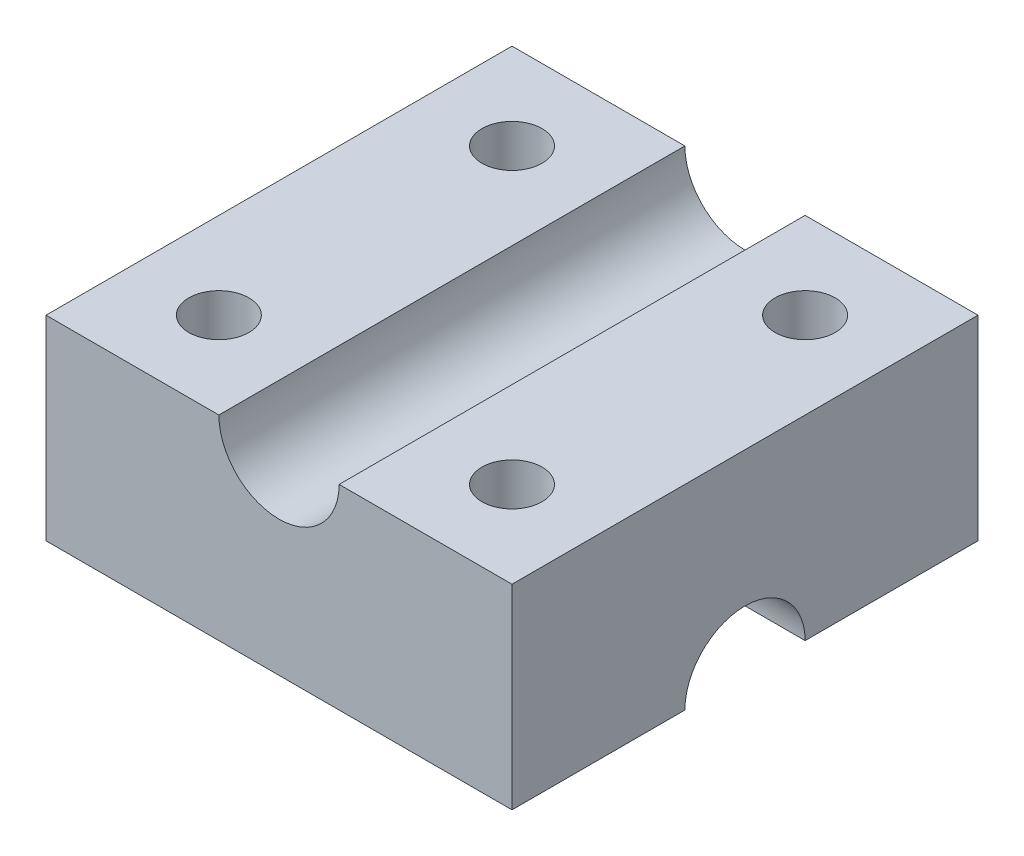
ISO-10303-21;
HEADER;
FILE_DESCRIPTION(('STEP AP214'),'2;1');
FILE_NAME('part.step','',(''),(''),'','','');
FILE_SCHEMA(('AUTOMOTIVE_DESIGN { 1 0 10303 214 1 1 1 1 }'));
ENDSEC;
DATA;
#1=APPLICATION_CONTEXT('core data for automotive mechanical design processes');
#2=APPLICATION_PROTOCOL_DEFINITION('international standard','automotive_design',2000,#1);
#3=PRODUCT_CONTEXT('',#1,'mechanical');
#4=PRODUCT('Part','Part','',(#3));
#5=PRODUCT_RELATED_PRODUCT_CATEGORY('part','',(#4));
#6=PRODUCT_DEFINITION_FORMATION('','',#4);
#7=PRODUCT_DEFINITION_CONTEXT('part definition',#1,'design');
#8=PRODUCT_DEFINITION('design','',#6,#7);
#9=PRODUCT_DEFINITION_SHAPE('','',#8);
#10=(LENGTH_UNIT() NAMED_UNIT(*) SI_UNIT(.MILLI.,.METRE.));
#11=(NAMED_UNIT(*) PLANE_ANGLE_UNIT() SI_UNIT($,.RADIAN.));
#12=(NAMED_UNIT(*) SI_UNIT($,.STERADIAN.) SOLID_ANGLE_UNIT());
#13=UNCERTAINTY_MEASURE_WITH_UNIT(LENGTH_MEASURE(1.E-05),#10,'distance_accuracy_value','');
#14=(GEOMETRIC_REPRESENTATION_CONTEXT(3) GLOBAL_UNCERTAINTY_ASSIGNED_CONTEXT((#13)) GLOBAL_UNIT_ASSIGNED_CONTEXT((#10,
#11,#12)) REPRESENTATION_CONTEXT('',''));
#15=CARTESIAN_POINT('',(0.,0.,0.));
#16=DIRECTION('',(0.,0.,1.));
#17=DIRECTION('',(1.,0.,0.));
#18=AXIS2_PLACEMENT_3D('',#15,#16,#17);
#19=CARTESIAN_POINT('',(-15.5,-6.5,31.));
#20=DIRECTION('',(0.,1.,0.));
#21=DIRECTION('',(0.,0.,1.));
#22=AXIS2_PLACEMENT_3D('',#19,#20,#21);
#23=PLANE('',#22);
#24=CARTESIAN_POINT('',(-9.75,-6.5,5.75));
#25=DIRECTION('',(0.,1.,0.));
#26=DIRECTION('',(0.,0.,-1.));
#27=AXIS2_PLACEMENT_3D('',#24,#25,#26);
#28=CIRCLE('',#27,2.);
#29=CARTESIAN_POINT('',(-9.75,-6.5,3.75));
#30=VERTEX_POINT('',#29);
#31=EDGE_CURVE('E232',#30,#30,#28,.T.);
#32=ORIENTED_EDGE('',*,*,#31,.T.);
#33=EDGE_LOOP('',(#32));
#34=FACE_BOUND('',#33,.T.);
#35=CARTESIAN_POINT('',(9.75,-6.5,5.75));
#36=DIRECTION('',(0.,1.,0.));
#37=DIRECTION('',(0.,0.,1.));
#38=AXIS2_PLACEMENT_3D('',#35,#36,#37);
#39=CIRCLE('',#38,2.);
#40=CARTESIAN_POINT('',(9.75,-6.5,7.75));
#41=VERTEX_POINT('',#40);
#42=EDGE_CURVE('E235',#41,#41,#39,.T.);
#43=ORIENTED_EDGE('',*,*,#42,.T.);
#44=EDGE_LOOP('',(#43));
#45=FACE_BOUND('',#44,.T.);
#46=DIRECTION('',(0.,0.,-1.));
#47=VECTOR('',#46,1.);
#48=CARTESIAN_POINT('',(15.5,-6.5,31.));
#49=LINE('',#48,#47);
#50=CARTESIAN_POINT('',(15.5,-6.5,11.5));
#51=VERTEX_POINT('',#50);
#52=CARTESIAN_POINT('',(15.5,-6.5,0.));
#53=VERTEX_POINT('',#52);
#54=EDGE_CURVE('E158',#51,#53,#49,.T.);
#55=ORIENTED_EDGE('',*,*,#54,.F.);
#56=DIRECTION('',(-1.,0.,0.));
#57=VECTOR('',#56,1.);
#58=CARTESIAN_POINT('',(15.5,-6.5,11.5));
#59=LINE('',#58,#57);
#60=CARTESIAN_POINT('',(-15.5,-6.5,11.5));
#61=VERTEX_POINT('',#60);
#62=EDGE_CURVE('E58',#51,#61,#59,.T.);
#63=ORIENTED_EDGE('',*,*,#62,.T.);
#64=DIRECTION('',(0.,0.,-1.));
#65=VECTOR('',#64,1.);
#66=CARTESIAN_POINT('',(-15.5,-6.5,31.));
#67=LINE('',#66,#65);
#68=CARTESIAN_POINT('',(-15.5,-6.5,0.));
#69=VERTEX_POINT('',#68);
#70=EDGE_CURVE('E132',#61,#69,#67,.T.);
#71=ORIENTED_EDGE('',*,*,#70,.T.);
#72=DIRECTION('',(1.,0.,0.));
#73=VECTOR('',#72,1.);
#74=CARTESIAN_POINT('',(-15.5,-6.5,0.));
#75=LINE('',#74,#73);
#76=EDGE_CURVE('E152',#69,#53,#75,.T.);
#77=ORIENTED_EDGE('',*,*,#76,.T.);
#78=EDGE_LOOP('',(#55,#63,#71,#77));
#79=FACE_BOUND('',#78,.T.);
#80=ADVANCED_FACE('F43',(#34,#45,#79),#23,.F.);
#81=CARTESIAN_POINT('',(4.,6.5,31.));
#82=DIRECTION('',(0.,-1.,0.));
#83=DIRECTION('',(0.,0.,-1.));
#84=AXIS2_PLACEMENT_3D('',#81,#82,#83);
#85=PLANE('',#84);
#86=CARTESIAN_POINT('',(9.75,6.5,25.25));
#87=DIRECTION('',(0.,1.,0.));
#88=DIRECTION('',(0.,0.,-1.));
#89=AXIS2_PLACEMENT_3D('',#86,#87,#88);
#90=CIRCLE('',#89,2.);
#91=CARTESIAN_POINT('',(9.75,6.5,23.25));
#92=VERTEX_POINT('',#91);
#93=EDGE_CURVE('E218',#92,#92,#90,.T.);
#94=ORIENTED_EDGE('',*,*,#93,.F.);
#95=EDGE_LOOP('',(#94));
#96=FACE_BOUND('',#95,.T.);
#97=CARTESIAN_POINT('',(9.75,6.5,5.75));
#98=DIRECTION('',(0.,1.,0.));
#99=DIRECTION('',(0.,0.,1.));
#100=AXIS2_PLACEMENT_3D('',#97,#98,#99);
#101=CIRCLE('',#100,2.);
#102=CARTESIAN_POINT('',(9.75,6.5,7.75));
#103=VERTEX_POINT('',#102);
#104=EDGE_CURVE('E222',#103,#103,#101,.T.);
#105=ORIENTED_EDGE('',*,*,#104,.F.);
#106=EDGE_LOOP('',(#105));
#107=FACE_BOUND('',#106,.T.);
#108=DIRECTION('',(-1.,0.,0.));
#109=VECTOR('',#108,1.);
#110=CARTESIAN_POINT('',(4.,6.5,0.));
#111=LINE('',#110,#109);
#112=CARTESIAN_POINT('',(15.5,6.5,0.));
#113=VERTEX_POINT('',#112);
#114=CARTESIAN_POINT('',(4.,6.5,0.));
#115=VERTEX_POINT('',#114);
#116=EDGE_CURVE('E142',#113,#115,#111,.T.);
#117=ORIENTED_EDGE('',*,*,#116,.T.);
#118=DIRECTION('',(0.,0.,-1.));
#119=VECTOR('',#118,1.);
#120=CARTESIAN_POINT('',(4.,6.5,31.));
#121=LINE('',#120,#119);
#122=CARTESIAN_POINT('',(4.,6.5,31.));
#123=VERTEX_POINT('',#122);
#124=EDGE_CURVE('E11',#123,#115,#121,.T.);
#125=ORIENTED_EDGE('',*,*,#124,.F.);
#126=DIRECTION('',(-1.,0.,0.));
#127=VECTOR('',#126,1.);
#128=CARTESIAN_POINT('',(4.,6.5,31.));
#129=LINE('',#128,#127);
#130=CARTESIAN_POINT('',(15.5,6.5,31.));
#131=VERTEX_POINT('',#130);
#132=EDGE_CURVE('E156',#131,#123,#129,.T.);
#133=ORIENTED_EDGE('',*,*,#132,.F.);
#134=DIRECTION('',(0.,0.,-1.));
#135=VECTOR('',#134,1.);
#136=CARTESIAN_POINT('',(15.5,6.5,31.));
#137=LINE('',#136,#135);
#138=EDGE_CURVE('E138',#131,#113,#137,.T.);
#139=ORIENTED_EDGE('',*,*,#138,.T.);
#140=EDGE_LOOP('',(#117,#125,#133,#139));
#141=FACE_BOUND('',#140,.T.);
#142=ADVANCED_FACE('F45',(#96,#107,#141),#85,.F.);
#143=CARTESIAN_POINT('',(0.,6.5,31.));
#144=DIRECTION('',(0.,0.,-1.));
#145=DIRECTION('',(-1.,0.,0.));
#146=AXIS2_PLACEMENT_3D('',#143,#144,#145);
#147=CYLINDRICAL_SURFACE('',#146,4.);
#148=CARTESIAN_POINT('',(0.,6.5,0.));
#149=DIRECTION('',(0.,0.,-1.));
#150=DIRECTION('',(1.,0.,0.));
#151=AXIS2_PLACEMENT_3D('',#148,#149,#150);
#152=CIRCLE('',#151,4.);
#153=CARTESIAN_POINT('',(-4.,6.5,0.));
#154=VERTEX_POINT('',#153);
#155=EDGE_CURVE('E145',#115,#154,#152,.T.);
#156=ORIENTED_EDGE('',*,*,#155,.T.);
#157=DIRECTION('',(0.,0.,-1.));
#158=VECTOR('',#157,1.);
#159=CARTESIAN_POINT('',(-4.,6.5,31.));
#160=LINE('',#159,#158);
#161=CARTESIAN_POINT('',(-4.,6.5,31.));
#162=VERTEX_POINT('',#161);
#163=EDGE_CURVE('E51',#162,#154,#160,.T.);
#164=ORIENTED_EDGE('',*,*,#163,.F.);
#165=CARTESIAN_POINT('',(0.,6.5,31.));
#166=DIRECTION('',(0.,0.,-1.));
#167=DIRECTION('',(1.,0.,0.));
#168=AXIS2_PLACEMENT_3D('',#165,#166,#167);
#169=CIRCLE('',#168,4.);
#170=EDGE_CURVE('E101',#123,#162,#169,.T.);
#171=ORIENTED_EDGE('',*,*,#170,.F.);
#172=ORIENTED_EDGE('',*,*,#124,.T.);
#173=EDGE_LOOP('',(#156,#164,#171,#172));
#174=FACE_BOUND('',#173,.T.);
#175=ADVANCED_FACE('F181',(#174),#147,.F.);
#176=CARTESIAN_POINT('',(-15.5,6.5,31.));
#177=DIRECTION('',(0.,-1.,0.));
#178=DIRECTION('',(0.,0.,-1.));
#179=AXIS2_PLACEMENT_3D('',#176,#177,#178);
#180=PLANE('',#179);
#181=CARTESIAN_POINT('',(-9.75,6.5,5.75));
#182=DIRECTION('',(0.,1.,0.));
#183=DIRECTION('',(0.,0.,-1.));
#184=AXIS2_PLACEMENT_3D('',#181,#182,#183);
#185=CIRCLE('',#184,2.);
#186=CARTESIAN_POINT('',(-9.75,6.5,3.75));
#187=VERTEX_POINT('',#186);
#188=EDGE_CURVE('E229',#187,#187,#185,.T.);
#189=ORIENTED_EDGE('',*,*,#188,.F.);
#190=EDGE_LOOP('',(#189));
#191=FACE_BOUND('',#190,.T.);
#192=CARTESIAN_POINT('',(-9.75,6.5,25.25));
#193=DIRECTION('',(0.,1.,0.));
#194=DIRECTION('',(0.,0.,1.));
#195=AXIS2_PLACEMENT_3D('',#192,#193,#194);
#196=CIRCLE('',#195,2.);
#197=CARTESIAN_POINT('',(-9.75,6.5,27.25));
#198=VERTEX_POINT('',#197);
#199=EDGE_CURVE('E219',#198,#198,#196,.T.);
#200=ORIENTED_EDGE('',*,*,#199,.F.);
#201=EDGE_LOOP('',(#200));
#202=FACE_BOUND('',#201,.T.);
#203=DIRECTION('',(-1.,0.,0.));
#204=VECTOR('',#203,1.);
#205=CARTESIAN_POINT('',(-15.5,6.5,0.));
#206=LINE('',#205,#204);
#207=CARTESIAN_POINT('',(-15.5,6.5,0.));
#208=VERTEX_POINT('',#207);
#209=EDGE_CURVE('E147',#154,#208,#206,.T.);
#210=ORIENTED_EDGE('',*,*,#209,.T.);
#211=DIRECTION('',(0.,0.,-1.));
#212=VECTOR('',#211,1.);
#213=CARTESIAN_POINT('',(-15.5,6.5,31.));
#214=LINE('',#213,#212);
#215=CARTESIAN_POINT('',(-15.5,6.5,31.));
#216=VERTEX_POINT('',#215);
#217=EDGE_CURVE('E131',#216,#208,#214,.T.);
#218=ORIENTED_EDGE('',*,*,#217,.F.);
#219=DIRECTION('',(-1.,0.,0.));
#220=VECTOR('',#219,1.);
#221=CARTESIAN_POINT('',(-15.5,6.5,31.));
#222=LINE('',#221,#220);
#223=EDGE_CURVE('E117',#162,#216,#222,.T.);
#224=ORIENTED_EDGE('',*,*,#223,.F.);
#225=ORIENTED_EDGE('',*,*,#163,.T.);
#226=EDGE_LOOP('',(#210,#218,#224,#225));
#227=FACE_BOUND('',#226,.T.);
#228=ADVANCED_FACE('F163',(#191,#202,#227),#180,.F.);
#229=CARTESIAN_POINT('',(-15.5,6.5,31.));
#230=DIRECTION('',(1.,0.,0.));
#231=DIRECTION('',(0.,0.,-1.));
#232=AXIS2_PLACEMENT_3D('',#229,#230,#231);
#233=PLANE('',#232);
#234=CARTESIAN_POINT('',(-15.5,1.5,15.5));
#235=DIRECTION('',(-1.,0.,0.));
#236=DIRECTION('',(0.,0.,1.));
#237=AXIS2_PLACEMENT_3D('',#234,#235,#236);
#238=CIRCLE('',#237,2.);
#239=CARTESIAN_POINT('',(-15.5,1.5,17.5));
#240=VERTEX_POINT('',#239);
#241=EDGE_CURVE('E372',#240,#240,#238,.T.);
#242=ORIENTED_EDGE('',*,*,#241,.F.);
#243=EDGE_LOOP('',(#242));
#244=FACE_BOUND('',#243,.T.);
#245=ORIENTED_EDGE('',*,*,#70,.F.);
#246=CARTESIAN_POINT('',(-15.5,-6.5,15.5));
#247=DIRECTION('',(-1.,0.,0.));
#248=DIRECTION('',(0.,0.,1.));
#249=AXIS2_PLACEMENT_3D('',#246,#247,#248);
#250=CIRCLE('',#249,4.);
#251=CARTESIAN_POINT('',(-15.5,-6.5,19.5));
#252=VERTEX_POINT('',#251);
#253=EDGE_CURVE('E128',#252,#61,#250,.T.);
#254=ORIENTED_EDGE('',*,*,#253,.F.);
#255=CARTESIAN_POINT('',(-15.5,-6.5,31.));
#256=VERTEX_POINT('',#255);
#257=EDGE_CURVE('E124',#256,#252,#67,.T.);
#258=ORIENTED_EDGE('',*,*,#257,.F.);
#259=DIRECTION('',(0.,-1.,0.));
#260=VECTOR('',#259,1.);
#261=CARTESIAN_POINT('',(-15.5,6.5,31.));
#262=LINE('',#261,#260);
#263=EDGE_CURVE('E110',#216,#256,#262,.T.);
#264=ORIENTED_EDGE('',*,*,#263,.F.);
#265=ORIENTED_EDGE('',*,*,#217,.T.);
#266=DIRECTION('',(0.,-1.,0.));
#267=VECTOR('',#266,1.);
#268=CARTESIAN_POINT('',(-15.5,6.5,0.));
#269=LINE('',#268,#267);
#270=EDGE_CURVE('E149',#208,#69,#269,.T.);
#271=ORIENTED_EDGE('',*,*,#270,.T.);
#272=EDGE_LOOP('',(#245,#254,#258,#264,#265,#271));
#273=FACE_BOUND('',#272,.T.);
#274=ADVANCED_FACE('F126',(#244,#273),#233,.F.);
#275=CARTESIAN_POINT('',(-9.75,-6.5,25.25));
#276=DIRECTION('',(0.,1.,0.));
#277=DIRECTION('',(0.,0.,1.));
#278=AXIS2_PLACEMENT_3D('',#275,#276,#277);
#279=CIRCLE('',#278,2.);
#280=CARTESIAN_POINT('',(-9.75,-6.5,27.25));
#281=VERTEX_POINT('',#280);
#282=EDGE_CURVE('E213',#281,#281,#279,.T.);
#283=ORIENTED_EDGE('',*,*,#282,.T.);
#284=EDGE_LOOP('',(#283));
#285=FACE_BOUND('',#284,.T.);
#286=CARTESIAN_POINT('',(9.75,-6.5,25.25));
#287=DIRECTION('',(0.,1.,0.));
#288=DIRECTION('',(0.,0.,-1.));
#289=AXIS2_PLACEMENT_3D('',#286,#287,#288);
#290=CIRCLE('',#289,2.);
#291=CARTESIAN_POINT('',(9.75,-6.5,23.25));
#292=VERTEX_POINT('',#291);
#293=EDGE_CURVE('E216',#292,#292,#290,.T.);
#294=ORIENTED_EDGE('',*,*,#293,.T.);
#295=EDGE_LOOP('',(#294));
#296=FACE_BOUND('',#295,.T.);
#297=ORIENTED_EDGE('',*,*,#257,.T.);
#298=DIRECTION('',(-1.,0.,0.));
#299=VECTOR('',#298,1.);
#300=CARTESIAN_POINT('',(15.5,-6.5,19.5));
#301=LINE('',#300,#299);
#302=CARTESIAN_POINT('',(15.5,-6.5,19.5));
#303=VERTEX_POINT('',#302);
#304=EDGE_CURVE('E171',#252,#303,#301,.F.);
#305=ORIENTED_EDGE('',*,*,#304,.T.);
#306=CARTESIAN_POINT('',(15.5,-6.5,31.));
#307=VERTEX_POINT('',#306);
#308=EDGE_CURVE('E136',#307,#303,#49,.T.);
#309=ORIENTED_EDGE('',*,*,#308,.F.);
#310=DIRECTION('',(1.,0.,0.));
#311=VECTOR('',#310,1.);
#312=CARTESIAN_POINT('',(-15.5,-6.5,31.));
#313=LINE('',#312,#311);
#314=EDGE_CURVE('E114',#256,#307,#313,.T.);
#315=ORIENTED_EDGE('',*,*,#314,.F.);
#316=EDGE_LOOP('',(#297,#305,#309,#315));
#317=FACE_BOUND('',#316,.T.);
#318=ADVANCED_FACE('F134',(#285,#296,#317),#23,.F.);
#319=CARTESIAN_POINT('',(15.5,6.5,31.));
#320=DIRECTION('',(-1.,0.,0.));
#321=DIRECTION('',(0.,0.,1.));
#322=AXIS2_PLACEMENT_3D('',#319,#320,#321);
#323=PLANE('',#322);
#324=ORIENTED_EDGE('',*,*,#308,.T.);
#325=CARTESIAN_POINT('',(15.5,-6.5,15.5));
#326=DIRECTION('',(-1.,0.,0.));
#327=DIRECTION('',(0.,0.,1.));
#328=AXIS2_PLACEMENT_3D('',#325,#326,#327);
#329=CIRCLE('',#328,4.);
#330=EDGE_CURVE('E173',#303,#51,#329,.T.);
#331=ORIENTED_EDGE('',*,*,#330,.T.);
#332=ORIENTED_EDGE('',*,*,#54,.T.);
#333=DIRECTION('',(0.,1.,0.));
#334=VECTOR('',#333,1.);
#335=CARTESIAN_POINT('',(15.5,6.5,0.));
#336=LINE('',#335,#334);
#337=EDGE_CURVE('E93',#53,#113,#336,.T.);
#338=ORIENTED_EDGE('',*,*,#337,.T.);
#339=ORIENTED_EDGE('',*,*,#138,.F.);
#340=DIRECTION('',(0.,1.,0.));
#341=VECTOR('',#340,1.);
#342=CARTESIAN_POINT('',(15.5,6.5,31.));
#343=LINE('',#342,#341);
#344=EDGE_CURVE('E67',#307,#131,#343,.T.);
#345=ORIENTED_EDGE('',*,*,#344,.F.);
#346=EDGE_LOOP('',(#324,#331,#332,#338,#339,#345));
#347=FACE_BOUND('',#346,.T.);
#348=ADVANCED_FACE('F202',(#347),#323,.F.);
#349=CARTESIAN_POINT('',(0.,6.5,31.));
#350=DIRECTION('',(0.,0.,1.));
#351=DIRECTION('',(1.,0.,0.));
#352=AXIS2_PLACEMENT_3D('',#349,#350,#351);
#353=PLANE('',#352);
#354=ORIENTED_EDGE('',*,*,#132,.T.);
#355=ORIENTED_EDGE('',*,*,#170,.T.);
#356=ORIENTED_EDGE('',*,*,#223,.T.);
#357=ORIENTED_EDGE('',*,*,#263,.T.);
#358=ORIENTED_EDGE('',*,*,#314,.T.);
#359=ORIENTED_EDGE('',*,*,#344,.T.);
#360=EDGE_LOOP('',(#354,#355,#356,#357,#358,#359));
#361=FACE_BOUND('',#360,.T.);
#362=ADVANCED_FACE('F112',(#361),#353,.T.);
#363=CARTESIAN_POINT('',(0.,6.5,0.));
#364=DIRECTION('',(0.,0.,1.));
#365=DIRECTION('',(1.,0.,0.));
#366=AXIS2_PLACEMENT_3D('',#363,#364,#365);
#367=PLANE('',#366);
#368=ORIENTED_EDGE('',*,*,#116,.F.);
#369=ORIENTED_EDGE('',*,*,#337,.F.);
#370=ORIENTED_EDGE('',*,*,#76,.F.);
#371=ORIENTED_EDGE('',*,*,#270,.F.);
#372=ORIENTED_EDGE('',*,*,#209,.F.);
#373=ORIENTED_EDGE('',*,*,#155,.F.);
#374=EDGE_LOOP('',(#368,#369,#370,#371,#372,#373));
#375=FACE_BOUND('',#374,.T.);
#376=ADVANCED_FACE('F167',(#375),#367,.F.);
#377=CARTESIAN_POINT('',(15.5,-6.5,15.5));
#378=DIRECTION('',(-1.,0.,0.));
#379=DIRECTION('',(0.,0.,1.));
#380=AXIS2_PLACEMENT_3D('',#377,#378,#379);
#381=CYLINDRICAL_SURFACE('',#380,4.);
#382=ORIENTED_EDGE('',*,*,#330,.F.);
#383=ORIENTED_EDGE('',*,*,#304,.F.);
#384=ORIENTED_EDGE('',*,*,#253,.T.);
#385=ORIENTED_EDGE('',*,*,#62,.F.);
#386=EDGE_LOOP('',(#382,#383,#384,#385));
#387=FACE_BOUND('',#386,.T.);
#388=ADVANCED_FACE('F241',(#387),#381,.F.);
#389=CARTESIAN_POINT('',(9.75,-6.5,25.25));
#390=DIRECTION('',(0.,1.,0.));
#391=DIRECTION('',(0.,0.,1.));
#392=AXIS2_PLACEMENT_3D('',#389,#390,#391);
#393=CYLINDRICAL_SURFACE('',#392,2.);
#394=ORIENTED_EDGE('',*,*,#293,.F.);
#395=EDGE_LOOP('',(#394));
#396=FACE_BOUND('',#395,.T.);
#397=ORIENTED_EDGE('',*,*,#93,.T.);
#398=EDGE_LOOP('',(#397));
#399=FACE_BOUND('',#398,.T.);
#400=ADVANCED_FACE('F244',(#396,#399),#393,.F.);
#401=CARTESIAN_POINT('',(-9.75,-6.5,25.25));
#402=DIRECTION('',(0.,1.,0.));
#403=DIRECTION('',(0.,0.,1.));
#404=AXIS2_PLACEMENT_3D('',#401,#402,#403);
#405=CYLINDRICAL_SURFACE('',#404,2.);
#406=ORIENTED_EDGE('',*,*,#282,.F.);
#407=EDGE_LOOP('',(#406));
#408=FACE_BOUND('',#407,.T.);
#409=ORIENTED_EDGE('',*,*,#199,.T.);
#410=EDGE_LOOP('',(#409));
#411=FACE_BOUND('',#410,.T.);
#412=ADVANCED_FACE('F248',(#408,#411),#405,.F.);
#413=CARTESIAN_POINT('',(-9.75,-6.5,5.75));
#414=DIRECTION('',(0.,1.,0.));
#415=DIRECTION('',(0.,0.,1.));
#416=AXIS2_PLACEMENT_3D('',#413,#414,#415);
#417=CYLINDRICAL_SURFACE('',#416,2.);
#418=ORIENTED_EDGE('',*,*,#31,.F.);
#419=EDGE_LOOP('',(#418));
#420=FACE_BOUND('',#419,.T.);
#421=ORIENTED_EDGE('',*,*,#188,.T.);
#422=EDGE_LOOP('',(#421));
#423=FACE_BOUND('',#422,.T.);
#424=ADVANCED_FACE('F326',(#420,#423),#417,.F.);
#425=CARTESIAN_POINT('',(9.75,-6.5,5.75));
#426=DIRECTION('',(0.,1.,0.));
#427=DIRECTION('',(0.,0.,1.));
#428=AXIS2_PLACEMENT_3D('',#425,#426,#427);
#429=CYLINDRICAL_SURFACE('',#428,2.);
#430=ORIENTED_EDGE('',*,*,#42,.F.);
#431=EDGE_LOOP('',(#430));
#432=FACE_BOUND('',#431,.T.);
#433=ORIENTED_EDGE('',*,*,#104,.T.);
#434=EDGE_LOOP('',(#433));
#435=FACE_BOUND('',#434,.T.);
#436=ADVANCED_FACE('F254',(#432,#435),#429,.F.);
#437=CARTESIAN_POINT('',(-5.5,1.5,15.5));
#438=DIRECTION('',(-1.,0.,0.));
#439=DIRECTION('',(0.,0.,1.));
#440=AXIS2_PLACEMENT_3D('',#437,#438,#439);
#441=CYLINDRICAL_SURFACE('',#440,2.);
#442=CARTESIAN_POINT('',(-5.5,1.5,15.5));
#443=DIRECTION('',(-1.,0.,0.));
#444=DIRECTION('',(0.,0.,1.));
#445=AXIS2_PLACEMENT_3D('',#442,#443,#444);
#446=CIRCLE('',#445,2.);
#447=CARTESIAN_POINT('',(-5.5,1.5,17.5));
#448=VERTEX_POINT('',#447);
#449=EDGE_CURVE('E234',#448,#448,#446,.T.);
#450=ORIENTED_EDGE('',*,*,#449,.F.);
#451=EDGE_LOOP('',(#450));
#452=FACE_BOUND('',#451,.T.);
#453=ORIENTED_EDGE('',*,*,#241,.T.);
#454=EDGE_LOOP('',(#453));
#455=FACE_BOUND('',#454,.T.);
#456=ADVANCED_FACE('F304',(#452,#455),#441,.F.);
#457=CARTESIAN_POINT('',(-5.5,1.5,15.5));
#458=DIRECTION('',(-1.,0.,0.));
#459=DIRECTION('',(0.,0.,1.));
#460=AXIS2_PLACEMENT_3D('',#457,#458,#459);
#461=PLANE('',#460);
#462=ORIENTED_EDGE('',*,*,#449,.T.);
#463=EDGE_LOOP('',(#462));
#464=FACE_BOUND('',#463,.T.);
#465=ADVANCED_FACE('F308',(#464),#461,.T.);
#466=CLOSED_SHELL('',(#80,#142,#175,#228,#274,#318,#348,#362,#376,#388,#400,#412,#424,#436,#456,#465));
#467=MANIFOLD_SOLID_BREP('B2',#466);
#468=ADVANCED_BREP_SHAPE_REPRESENTATION('',(#18,#467),#14);
#469=SHAPE_DEFINITION_REPRESENTATION(#9,#468);
ENDSEC;
END-ISO-10303-21;
